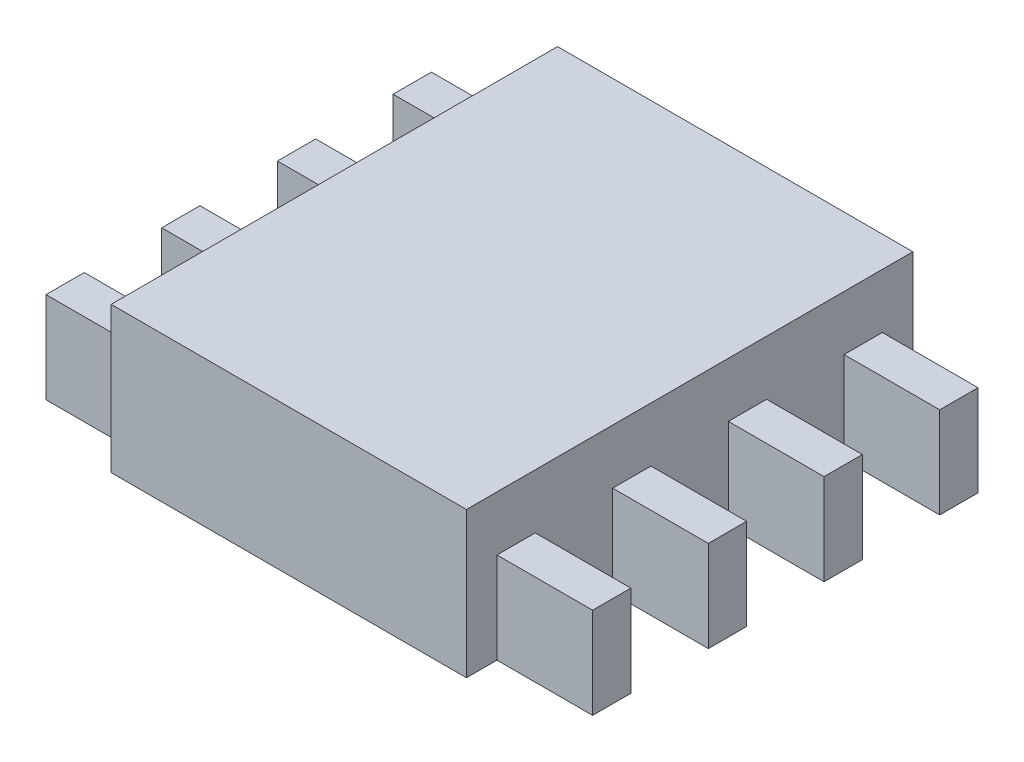
ISO-10303-21;
HEADER;
FILE_DESCRIPTION(('STEP AP214'),'2;1');
FILE_NAME('part.step','',(''),(''),'','','');
FILE_SCHEMA(('AUTOMOTIVE_DESIGN { 1 0 10303 214 1 1 1 1 }'));
ENDSEC;
DATA;
#1=APPLICATION_CONTEXT('core data for automotive mechanical design processes');
#2=APPLICATION_PROTOCOL_DEFINITION('international standard','automotive_design',2000,#1);
#3=PRODUCT_CONTEXT('',#1,'mechanical');
#4=PRODUCT('Part','Part','',(#3));
#5=PRODUCT_RELATED_PRODUCT_CATEGORY('part','',(#4));
#6=PRODUCT_DEFINITION_FORMATION('','',#4);
#7=PRODUCT_DEFINITION_CONTEXT('part definition',#1,'design');
#8=PRODUCT_DEFINITION('design','',#6,#7);
#9=PRODUCT_DEFINITION_SHAPE('','',#8);
#10=(LENGTH_UNIT() NAMED_UNIT(*) SI_UNIT(.MILLI.,.METRE.));
#11=(NAMED_UNIT(*) PLANE_ANGLE_UNIT() SI_UNIT($,.RADIAN.));
#12=(NAMED_UNIT(*) SI_UNIT($,.STERADIAN.) SOLID_ANGLE_UNIT());
#13=UNCERTAINTY_MEASURE_WITH_UNIT(LENGTH_MEASURE(1.E-05),#10,'distance_accuracy_value','');
#14=(GEOMETRIC_REPRESENTATION_CONTEXT(3) GLOBAL_UNCERTAINTY_ASSIGNED_CONTEXT((#13)) GLOBAL_UNIT_ASSIGNED_CONTEXT((#10,
#11,#12)) REPRESENTATION_CONTEXT('',''));
#15=CARTESIAN_POINT('',(0.,0.,0.));
#16=DIRECTION('',(0.,0.,1.));
#17=DIRECTION('',(1.,0.,0.));
#18=AXIS2_PLACEMENT_3D('',#15,#16,#17);
#19=CARTESIAN_POINT('',(1.95,1.6,-2.45));
#20=DIRECTION('',(-1.,0.,0.));
#21=DIRECTION('',(0.,0.,1.));
#22=AXIS2_PLACEMENT_3D('',#19,#20,#21);
#23=PLANE('',#22);
#24=DIRECTION('',(0.,-1.,0.));
#25=VECTOR('',#24,1.);
#26=CARTESIAN_POINT('',(1.95,1.,-1.695));
#27=LINE('',#26,#25);
#28=CARTESIAN_POINT('',(1.95,1.,-1.695));
#29=VERTEX_POINT('',#28);
#30=CARTESIAN_POINT('',(1.95,0.,-1.695));
#31=VERTEX_POINT('',#30);
#32=EDGE_CURVE('E390',#29,#31,#27,.T.);
#33=ORIENTED_EDGE('',*,*,#32,.F.);
#34=DIRECTION('',(0.,0.,1.));
#35=VECTOR('',#34,1.);
#36=CARTESIAN_POINT('',(1.95,1.,-2.115));
#37=LINE('',#36,#35);
#38=CARTESIAN_POINT('',(1.95,1.,-2.115));
#39=VERTEX_POINT('',#38);
#40=EDGE_CURVE('E385',#39,#29,#37,.T.);
#41=ORIENTED_EDGE('',*,*,#40,.F.);
#42=DIRECTION('',(0.,-1.,0.));
#43=VECTOR('',#42,1.);
#44=CARTESIAN_POINT('',(1.95,1.,-2.115));
#45=LINE('',#44,#43);
#46=CARTESIAN_POINT('',(1.95,0.,-2.115));
#47=VERTEX_POINT('',#46);
#48=EDGE_CURVE('E633',#39,#47,#45,.T.);
#49=ORIENTED_EDGE('',*,*,#48,.T.);
#50=DIRECTION('',(0.,0.,-1.));
#51=VECTOR('',#50,1.);
#52=CARTESIAN_POINT('',(1.95,0.,-2.45));
#53=LINE('',#52,#51);
#54=CARTESIAN_POINT('',(1.95,0.,-2.45));
#55=VERTEX_POINT('',#54);
#56=EDGE_CURVE('E371',#47,#55,#53,.T.);
#57=ORIENTED_EDGE('',*,*,#56,.T.);
#58=DIRECTION('',(0.,-1.,0.));
#59=VECTOR('',#58,1.);
#60=CARTESIAN_POINT('',(1.95,1.6,-2.45));
#61=LINE('',#60,#59);
#62=CARTESIAN_POINT('',(1.95,1.6,-2.45));
#63=VERTEX_POINT('',#62);
#64=EDGE_CURVE('E855',#63,#55,#61,.T.);
#65=ORIENTED_EDGE('',*,*,#64,.F.);
#66=DIRECTION('',(0.,0.,-1.));
#67=VECTOR('',#66,1.);
#68=CARTESIAN_POINT('',(1.95,1.6,-2.45));
#69=LINE('',#68,#67);
#70=CARTESIAN_POINT('',(1.95,1.6,2.45));
#71=VERTEX_POINT('',#70);
#72=EDGE_CURVE('E854',#71,#63,#69,.T.);
#73=ORIENTED_EDGE('',*,*,#72,.F.);
#74=DIRECTION('',(0.,-1.,0.));
#75=VECTOR('',#74,1.);
#76=CARTESIAN_POINT('',(1.95,1.6,2.45));
#77=LINE('',#76,#75);
#78=CARTESIAN_POINT('',(1.95,0.,2.45));
#79=VERTEX_POINT('',#78);
#80=EDGE_CURVE('E377',#71,#79,#77,.T.);
#81=ORIENTED_EDGE('',*,*,#80,.T.);
#82=CARTESIAN_POINT('',(1.95,0.,2.115));
#83=VERTEX_POINT('',#82);
#84=EDGE_CURVE('E745',#79,#83,#53,.T.);
#85=ORIENTED_EDGE('',*,*,#84,.T.);
#86=DIRECTION('',(0.,-1.,0.));
#87=VECTOR('',#86,1.);
#88=CARTESIAN_POINT('',(1.95,1.,2.115));
#89=LINE('',#88,#87);
#90=CARTESIAN_POINT('',(1.95,1.,2.115));
#91=VERTEX_POINT('',#90);
#92=EDGE_CURVE('E725',#91,#83,#89,.T.);
#93=ORIENTED_EDGE('',*,*,#92,.F.);
#94=DIRECTION('',(0.,0.,1.));
#95=VECTOR('',#94,1.);
#96=CARTESIAN_POINT('',(1.95,1.,1.695));
#97=LINE('',#96,#95);
#98=CARTESIAN_POINT('',(1.95,1.,1.695));
#99=VERTEX_POINT('',#98);
#100=EDGE_CURVE('E699',#99,#91,#97,.T.);
#101=ORIENTED_EDGE('',*,*,#100,.F.);
#102=DIRECTION('',(0.,-1.,0.));
#103=VECTOR('',#102,1.);
#104=CARTESIAN_POINT('',(1.95,1.,1.695));
#105=LINE('',#104,#103);
#106=CARTESIAN_POINT('',(1.95,0.,1.695));
#107=VERTEX_POINT('',#106);
#108=EDGE_CURVE('E708',#99,#107,#105,.T.);
#109=ORIENTED_EDGE('',*,*,#108,.T.);
#110=CARTESIAN_POINT('',(1.95,0.,0.845));
#111=VERTEX_POINT('',#110);
#112=EDGE_CURVE('E717',#107,#111,#53,.T.);
#113=ORIENTED_EDGE('',*,*,#112,.T.);
#114=DIRECTION('',(0.,-1.,0.));
#115=VECTOR('',#114,1.);
#116=CARTESIAN_POINT('',(1.95,1.,0.845));
#117=LINE('',#116,#115);
#118=CARTESIAN_POINT('',(1.95,1.,0.845));
#119=VERTEX_POINT('',#118);
#120=EDGE_CURVE('E692',#119,#111,#117,.T.);
#121=ORIENTED_EDGE('',*,*,#120,.F.);
#122=DIRECTION('',(0.,0.,1.));
#123=VECTOR('',#122,1.);
#124=CARTESIAN_POINT('',(1.95,1.,0.425));
#125=LINE('',#124,#123);
#126=CARTESIAN_POINT('',(1.95,1.,0.425));
#127=VERTEX_POINT('',#126);
#128=EDGE_CURVE('E673',#127,#119,#125,.T.);
#129=ORIENTED_EDGE('',*,*,#128,.F.);
#130=DIRECTION('',(0.,-1.,0.));
#131=VECTOR('',#130,1.);
#132=CARTESIAN_POINT('',(1.95,1.,0.425));
#133=LINE('',#132,#131);
#134=CARTESIAN_POINT('',(1.95,0.,0.425));
#135=VERTEX_POINT('',#134);
#136=EDGE_CURVE('E683',#127,#135,#133,.T.);
#137=ORIENTED_EDGE('',*,*,#136,.T.);
#138=CARTESIAN_POINT('',(1.95,0.,-0.425));
#139=VERTEX_POINT('',#138);
#140=EDGE_CURVE('E732',#135,#139,#53,.T.);
#141=ORIENTED_EDGE('',*,*,#140,.T.);
#142=DIRECTION('',(0.,-1.,0.));
#143=VECTOR('',#142,1.);
#144=CARTESIAN_POINT('',(1.95,1.,-0.425));
#145=LINE('',#144,#143);
#146=CARTESIAN_POINT('',(1.95,1.,-0.425));
#147=VERTEX_POINT('',#146);
#148=EDGE_CURVE('E663',#147,#139,#145,.T.);
#149=ORIENTED_EDGE('',*,*,#148,.F.);
#150=DIRECTION('',(0.,0.,1.));
#151=VECTOR('',#150,1.);
#152=CARTESIAN_POINT('',(1.95,1.,-0.845));
#153=LINE('',#152,#151);
#154=CARTESIAN_POINT('',(1.95,1.,-0.845));
#155=VERTEX_POINT('',#154);
#156=EDGE_CURVE('E644',#155,#147,#153,.T.);
#157=ORIENTED_EDGE('',*,*,#156,.F.);
#158=DIRECTION('',(0.,-1.,0.));
#159=VECTOR('',#158,1.);
#160=CARTESIAN_POINT('',(1.95,1.,-0.845));
#161=LINE('',#160,#159);
#162=CARTESIAN_POINT('',(1.95,0.,-0.845));
#163=VERTEX_POINT('',#162);
#164=EDGE_CURVE('E654',#155,#163,#161,.T.);
#165=ORIENTED_EDGE('',*,*,#164,.T.);
#166=EDGE_CURVE('E733',#163,#31,#53,.T.);
#167=ORIENTED_EDGE('',*,*,#166,.T.);
#168=EDGE_LOOP('',(#33,#41,#49,#57,#65,#73,#81,#85,#93,#101,#109,#113,#121,#129,#137,#141,#149,
#157,#165,#167));
#169=FACE_BOUND('',#168,.T.);
#170=ADVANCED_FACE('F367',(#169),#23,.F.);
#171=CARTESIAN_POINT('',(-1.95,1.6,-2.45));
#172=DIRECTION('',(1.,0.,0.));
#173=DIRECTION('',(0.,0.,-1.));
#174=AXIS2_PLACEMENT_3D('',#171,#172,#173);
#175=PLANE('',#174);
#176=DIRECTION('',(0.,-1.,0.));
#177=VECTOR('',#176,1.);
#178=CARTESIAN_POINT('',(-1.95,1.,1.695));
#179=LINE('',#178,#177);
#180=CARTESIAN_POINT('',(-1.95,1.,1.695));
#181=VERTEX_POINT('',#180);
#182=CARTESIAN_POINT('',(-1.95,0.,1.695));
#183=VERTEX_POINT('',#182);
#184=EDGE_CURVE('E952',#181,#183,#179,.T.);
#185=ORIENTED_EDGE('',*,*,#184,.F.);
#186=DIRECTION('',(0.,0.,-1.));
#187=VECTOR('',#186,1.);
#188=CARTESIAN_POINT('',(-1.95,1.,1.695));
#189=LINE('',#188,#187);
#190=CARTESIAN_POINT('',(-1.95,1.,2.115));
#191=VERTEX_POINT('',#190);
#192=EDGE_CURVE('E932',#191,#181,#189,.T.);
#193=ORIENTED_EDGE('',*,*,#192,.F.);
#194=DIRECTION('',(0.,-1.,0.));
#195=VECTOR('',#194,1.);
#196=CARTESIAN_POINT('',(-1.95,1.,2.115));
#197=LINE('',#196,#195);
#198=CARTESIAN_POINT('',(-1.95,0.,2.115));
#199=VERTEX_POINT('',#198);
#200=EDGE_CURVE('E923',#191,#199,#197,.T.);
#201=ORIENTED_EDGE('',*,*,#200,.T.);
#202=DIRECTION('',(0.,0.,1.));
#203=VECTOR('',#202,1.);
#204=CARTESIAN_POINT('',(-1.95,0.,-2.45));
#205=LINE('',#204,#203);
#206=CARTESIAN_POINT('',(-1.95,0.,2.45));
#207=VERTEX_POINT('',#206);
#208=EDGE_CURVE('E748',#199,#207,#205,.T.);
#209=ORIENTED_EDGE('',*,*,#208,.T.);
#210=DIRECTION('',(0.,-1.,0.));
#211=VECTOR('',#210,1.);
#212=CARTESIAN_POINT('',(-1.95,1.6,2.45));
#213=LINE('',#212,#211);
#214=CARTESIAN_POINT('',(-1.95,1.6,2.45));
#215=VERTEX_POINT('',#214);
#216=EDGE_CURVE('E11',#215,#207,#213,.T.);
#217=ORIENTED_EDGE('',*,*,#216,.F.);
#218=DIRECTION('',(0.,0.,1.));
#219=VECTOR('',#218,1.);
#220=CARTESIAN_POINT('',(-1.95,1.6,-2.45));
#221=LINE('',#220,#219);
#222=CARTESIAN_POINT('',(-1.95,1.6,-2.45));
#223=VERTEX_POINT('',#222);
#224=EDGE_CURVE('E912',#223,#215,#221,.T.);
#225=ORIENTED_EDGE('',*,*,#224,.F.);
#226=DIRECTION('',(0.,-1.,0.));
#227=VECTOR('',#226,1.);
#228=CARTESIAN_POINT('',(-1.95,1.6,-2.45));
#229=LINE('',#228,#227);
#230=CARTESIAN_POINT('',(-1.95,0.,-2.45));
#231=VERTEX_POINT('',#230);
#232=EDGE_CURVE('E910',#223,#231,#229,.T.);
#233=ORIENTED_EDGE('',*,*,#232,.T.);
#234=CARTESIAN_POINT('',(-1.95,0.,-2.115));
#235=VERTEX_POINT('',#234);
#236=EDGE_CURVE('E765',#231,#235,#205,.T.);
#237=ORIENTED_EDGE('',*,*,#236,.T.);
#238=DIRECTION('',(0.,-1.,0.));
#239=VECTOR('',#238,1.);
#240=CARTESIAN_POINT('',(-1.95,1.,-2.115));
#241=LINE('',#240,#239);
#242=CARTESIAN_POINT('',(-1.95,1.,-2.115));
#243=VERTEX_POINT('',#242);
#244=EDGE_CURVE('E751',#243,#235,#241,.T.);
#245=ORIENTED_EDGE('',*,*,#244,.F.);
#246=DIRECTION('',(0.,0.,-1.));
#247=VECTOR('',#246,1.);
#248=CARTESIAN_POINT('',(-1.95,1.,-2.115));
#249=LINE('',#248,#247);
#250=CARTESIAN_POINT('',(-1.95,1.,-1.695));
#251=VERTEX_POINT('',#250);
#252=EDGE_CURVE('E781',#251,#243,#249,.T.);
#253=ORIENTED_EDGE('',*,*,#252,.F.);
#254=DIRECTION('',(0.,-1.,0.));
#255=VECTOR('',#254,1.);
#256=CARTESIAN_POINT('',(-1.95,1.,-1.695));
#257=LINE('',#256,#255);
#258=CARTESIAN_POINT('',(-1.95,0.,-1.695));
#259=VERTEX_POINT('',#258);
#260=EDGE_CURVE('E782',#251,#259,#257,.T.);
#261=ORIENTED_EDGE('',*,*,#260,.T.);
#262=CARTESIAN_POINT('',(-1.95,0.,-0.844999999999999));
#263=VERTEX_POINT('',#262);
#264=EDGE_CURVE('E760',#259,#263,#205,.T.);
#265=ORIENTED_EDGE('',*,*,#264,.T.);
#266=DIRECTION('',(0.,-1.,0.));
#267=VECTOR('',#266,1.);
#268=CARTESIAN_POINT('',(-1.95,1.,-0.844999999999999));
#269=LINE('',#268,#267);
#270=CARTESIAN_POINT('',(-1.95,1.,-0.845));
#271=VERTEX_POINT('',#270);
#272=EDGE_CURVE('E777',#271,#263,#269,.T.);
#273=ORIENTED_EDGE('',*,*,#272,.F.);
#274=DIRECTION('',(0.,0.,-1.));
#275=VECTOR('',#274,1.);
#276=CARTESIAN_POINT('',(-1.95,1.,-0.844999999999999));
#277=LINE('',#276,#275);
#278=CARTESIAN_POINT('',(-1.95,1.,-0.425));
#279=VERTEX_POINT('',#278);
#280=EDGE_CURVE('E991',#279,#271,#277,.T.);
#281=ORIENTED_EDGE('',*,*,#280,.F.);
#282=DIRECTION('',(0.,-1.,0.));
#283=VECTOR('',#282,1.);
#284=CARTESIAN_POINT('',(-1.95,1.,-0.424999999999999));
#285=LINE('',#284,#283);
#286=CARTESIAN_POINT('',(-1.95,0.,-0.424999999999999));
#287=VERTEX_POINT('',#286);
#288=EDGE_CURVE('E1001',#279,#287,#285,.T.);
#289=ORIENTED_EDGE('',*,*,#288,.T.);
#290=CARTESIAN_POINT('',(-1.95,0.,0.425));
#291=VERTEX_POINT('',#290);
#292=EDGE_CURVE('E766',#287,#291,#205,.T.);
#293=ORIENTED_EDGE('',*,*,#292,.T.);
#294=DIRECTION('',(0.,-1.,0.));
#295=VECTOR('',#294,1.);
#296=CARTESIAN_POINT('',(-1.95,1.,0.425));
#297=LINE('',#296,#295);
#298=CARTESIAN_POINT('',(-1.95,1.,0.425));
#299=VERTEX_POINT('',#298);
#300=EDGE_CURVE('E981',#299,#291,#297,.T.);
#301=ORIENTED_EDGE('',*,*,#300,.F.);
#302=DIRECTION('',(0.,0.,-1.));
#303=VECTOR('',#302,1.);
#304=CARTESIAN_POINT('',(-1.95,1.,0.425));
#305=LINE('',#304,#303);
#306=CARTESIAN_POINT('',(-1.95,1.,0.845));
#307=VERTEX_POINT('',#306);
#308=EDGE_CURVE('E962',#307,#299,#305,.T.);
#309=ORIENTED_EDGE('',*,*,#308,.F.);
#310=DIRECTION('',(0.,-1.,0.));
#311=VECTOR('',#310,1.);
#312=CARTESIAN_POINT('',(-1.95,1.,0.845));
#313=LINE('',#312,#311);
#314=CARTESIAN_POINT('',(-1.95,0.,0.845));
#315=VERTEX_POINT('',#314);
#316=EDGE_CURVE('E972',#307,#315,#313,.T.);
#317=ORIENTED_EDGE('',*,*,#316,.T.);
#318=EDGE_CURVE('E750',#315,#183,#205,.T.);
#319=ORIENTED_EDGE('',*,*,#318,.T.);
#320=EDGE_LOOP('',(#185,#193,#201,#209,#217,#225,#233,#237,#245,#253,#261,#265,#273,#281,#289,
#293,#301,#309,#317,#319));
#321=FACE_BOUND('',#320,.T.);
#322=ADVANCED_FACE('F369',(#321),#175,.F.);
#323=CARTESIAN_POINT('',(-1.95,1.6,2.45));
#324=DIRECTION('',(0.,0.,-1.));
#325=DIRECTION('',(-1.,0.,0.));
#326=AXIS2_PLACEMENT_3D('',#323,#324,#325);
#327=PLANE('',#326);
#328=DIRECTION('',(1.,0.,0.));
#329=VECTOR('',#328,1.);
#330=CARTESIAN_POINT('',(-1.95,0.,2.45));
#331=LINE('',#330,#329);
#332=EDGE_CURVE('E737',#207,#79,#331,.T.);
#333=ORIENTED_EDGE('',*,*,#332,.T.);
#334=ORIENTED_EDGE('',*,*,#80,.F.);
#335=DIRECTION('',(1.,0.,0.));
#336=VECTOR('',#335,1.);
#337=CARTESIAN_POINT('',(-1.95,1.6,2.45));
#338=LINE('',#337,#336);
#339=EDGE_CURVE('E914',#215,#71,#338,.T.);
#340=ORIENTED_EDGE('',*,*,#339,.F.);
#341=ORIENTED_EDGE('',*,*,#216,.T.);
#342=EDGE_LOOP('',(#333,#334,#340,#341));
#343=FACE_BOUND('',#342,.T.);
#344=ADVANCED_FACE('F836',(#343),#327,.F.);
#345=CARTESIAN_POINT('',(-1.95,1.6,-2.45));
#346=DIRECTION('',(0.,0.,1.));
#347=DIRECTION('',(1.,0.,0.));
#348=AXIS2_PLACEMENT_3D('',#345,#346,#347);
#349=PLANE('',#348);
#350=DIRECTION('',(-1.,0.,0.));
#351=VECTOR('',#350,1.);
#352=CARTESIAN_POINT('',(-1.95,0.,-2.45));
#353=LINE('',#352,#351);
#354=EDGE_CURVE('E739',#55,#231,#353,.T.);
#355=ORIENTED_EDGE('',*,*,#354,.T.);
#356=ORIENTED_EDGE('',*,*,#232,.F.);
#357=DIRECTION('',(-1.,0.,0.));
#358=VECTOR('',#357,1.);
#359=CARTESIAN_POINT('',(-1.95,1.6,-2.45));
#360=LINE('',#359,#358);
#361=EDGE_CURVE('E909',#63,#223,#360,.T.);
#362=ORIENTED_EDGE('',*,*,#361,.F.);
#363=ORIENTED_EDGE('',*,*,#64,.T.);
#364=EDGE_LOOP('',(#355,#356,#362,#363));
#365=FACE_BOUND('',#364,.T.);
#366=ADVANCED_FACE('F838',(#365),#349,.F.);
#367=CARTESIAN_POINT('',(-1.95,1.6,2.45));
#368=DIRECTION('',(0.,1.,0.));
#369=DIRECTION('',(0.,0.,1.));
#370=AXIS2_PLACEMENT_3D('',#367,#368,#369);
#371=PLANE('',#370);
#372=ORIENTED_EDGE('',*,*,#224,.T.);
#373=ORIENTED_EDGE('',*,*,#339,.T.);
#374=ORIENTED_EDGE('',*,*,#72,.T.);
#375=ORIENTED_EDGE('',*,*,#361,.T.);
#376=EDGE_LOOP('',(#372,#373,#374,#375));
#377=FACE_BOUND('',#376,.T.);
#378=ADVANCED_FACE('F828',(#377),#371,.T.);
#379=CARTESIAN_POINT('',(-1.95,0.,2.45));
#380=DIRECTION('',(0.,1.,0.));
#381=DIRECTION('',(0.,0.,1.));
#382=AXIS2_PLACEMENT_3D('',#379,#380,#381);
#383=PLANE('',#382);
#384=ORIENTED_EDGE('',*,*,#236,.F.);
#385=ORIENTED_EDGE('',*,*,#354,.F.);
#386=ORIENTED_EDGE('',*,*,#56,.F.);
#387=DIRECTION('',(-1.,0.,0.));
#388=VECTOR('',#387,1.);
#389=CARTESIAN_POINT('',(1.95,0.,-2.115));
#390=LINE('',#389,#388);
#391=CARTESIAN_POINT('',(3.,0.,-2.115));
#392=VERTEX_POINT('',#391);
#393=EDGE_CURVE('E623',#392,#47,#390,.T.);
#394=ORIENTED_EDGE('',*,*,#393,.F.);
#395=DIRECTION('',(0.,0.,-1.));
#396=VECTOR('',#395,1.);
#397=CARTESIAN_POINT('',(3.,0.,-2.115));
#398=LINE('',#397,#396);
#399=CARTESIAN_POINT('',(3.,0.,-1.695));
#400=VERTEX_POINT('',#399);
#401=EDGE_CURVE('E610',#400,#392,#398,.T.);
#402=ORIENTED_EDGE('',*,*,#401,.F.);
#403=DIRECTION('',(1.,0.,0.));
#404=VECTOR('',#403,1.);
#405=CARTESIAN_POINT('',(1.95,0.,-1.695));
#406=LINE('',#405,#404);
#407=EDGE_CURVE('E603',#31,#400,#406,.T.);
#408=ORIENTED_EDGE('',*,*,#407,.F.);
#409=ORIENTED_EDGE('',*,*,#166,.F.);
#410=DIRECTION('',(-1.,0.,0.));
#411=VECTOR('',#410,1.);
#412=CARTESIAN_POINT('',(1.95,0.,-0.845));
#413=LINE('',#412,#411);
#414=CARTESIAN_POINT('',(3.,0.,-0.845));
#415=VERTEX_POINT('',#414);
#416=EDGE_CURVE('E641',#415,#163,#413,.T.);
#417=ORIENTED_EDGE('',*,*,#416,.F.);
#418=DIRECTION('',(0.,0.,-1.));
#419=VECTOR('',#418,1.);
#420=CARTESIAN_POINT('',(3.,0.,-0.845));
#421=LINE('',#420,#419);
#422=CARTESIAN_POINT('',(3.,0.,-0.425));
#423=VERTEX_POINT('',#422);
#424=EDGE_CURVE('E639',#423,#415,#421,.T.);
#425=ORIENTED_EDGE('',*,*,#424,.F.);
#426=DIRECTION('',(1.,0.,0.));
#427=VECTOR('',#426,1.);
#428=CARTESIAN_POINT('',(1.95,0.,-0.425));
#429=LINE('',#428,#427);
#430=EDGE_CURVE('E637',#139,#423,#429,.T.);
#431=ORIENTED_EDGE('',*,*,#430,.F.);
#432=ORIENTED_EDGE('',*,*,#140,.F.);
#433=DIRECTION('',(-1.,0.,0.));
#434=VECTOR('',#433,1.);
#435=CARTESIAN_POINT('',(1.95,0.,0.425));
#436=LINE('',#435,#434);
#437=CARTESIAN_POINT('',(3.,0.,0.425));
#438=VERTEX_POINT('',#437);
#439=EDGE_CURVE('E670',#438,#135,#436,.T.);
#440=ORIENTED_EDGE('',*,*,#439,.F.);
#441=DIRECTION('',(0.,0.,-1.));
#442=VECTOR('',#441,1.);
#443=CARTESIAN_POINT('',(3.,0.,0.425));
#444=LINE('',#443,#442);
#445=CARTESIAN_POINT('',(3.,0.,0.845));
#446=VERTEX_POINT('',#445);
#447=EDGE_CURVE('E668',#446,#438,#444,.T.);
#448=ORIENTED_EDGE('',*,*,#447,.F.);
#449=DIRECTION('',(1.,0.,0.));
#450=VECTOR('',#449,1.);
#451=CARTESIAN_POINT('',(1.95,0.,0.845));
#452=LINE('',#451,#450);
#453=EDGE_CURVE('E666',#111,#446,#452,.T.);
#454=ORIENTED_EDGE('',*,*,#453,.F.);
#455=ORIENTED_EDGE('',*,*,#112,.F.);
#456=DIRECTION('',(-1.,0.,0.));
#457=VECTOR('',#456,1.);
#458=CARTESIAN_POINT('',(1.95,0.,1.695));
#459=LINE('',#458,#457);
#460=CARTESIAN_POINT('',(3.,0.,1.695));
#461=VERTEX_POINT('',#460);
#462=EDGE_CURVE('E698',#461,#107,#459,.T.);
#463=ORIENTED_EDGE('',*,*,#462,.F.);
#464=DIRECTION('',(0.,0.,-1.));
#465=VECTOR('',#464,1.);
#466=CARTESIAN_POINT('',(3.,0.,1.695));
#467=LINE('',#466,#465);
#468=CARTESIAN_POINT('',(3.,0.,2.115));
#469=VERTEX_POINT('',#468);
#470=EDGE_CURVE('E696',#469,#461,#467,.T.);
#471=ORIENTED_EDGE('',*,*,#470,.F.);
#472=DIRECTION('',(1.,0.,0.));
#473=VECTOR('',#472,1.);
#474=CARTESIAN_POINT('',(1.95,0.,2.115));
#475=LINE('',#474,#473);
#476=EDGE_CURVE('E695',#83,#469,#475,.T.);
#477=ORIENTED_EDGE('',*,*,#476,.F.);
#478=ORIENTED_EDGE('',*,*,#84,.F.);
#479=ORIENTED_EDGE('',*,*,#332,.F.);
#480=ORIENTED_EDGE('',*,*,#208,.F.);
#481=DIRECTION('',(1.,0.,0.));
#482=VECTOR('',#481,1.);
#483=CARTESIAN_POINT('',(-1.95,0.,2.115));
#484=LINE('',#483,#482);
#485=CARTESIAN_POINT('',(-3.,0.,2.115));
#486=VERTEX_POINT('',#485);
#487=EDGE_CURVE('E927',#486,#199,#484,.T.);
#488=ORIENTED_EDGE('',*,*,#487,.F.);
#489=DIRECTION('',(0.,0.,1.));
#490=VECTOR('',#489,1.);
#491=CARTESIAN_POINT('',(-3.,0.,1.695));
#492=LINE('',#491,#490);
#493=CARTESIAN_POINT('',(-3.,0.,1.695));
#494=VERTEX_POINT('',#493);
#495=EDGE_CURVE('E929',#494,#486,#492,.T.);
#496=ORIENTED_EDGE('',*,*,#495,.F.);
#497=DIRECTION('',(-1.,0.,0.));
#498=VECTOR('',#497,1.);
#499=CARTESIAN_POINT('',(-1.95,0.,1.695));
#500=LINE('',#499,#498);
#501=EDGE_CURVE('E728',#183,#494,#500,.T.);
#502=ORIENTED_EDGE('',*,*,#501,.F.);
#503=ORIENTED_EDGE('',*,*,#318,.F.);
#504=DIRECTION('',(1.,0.,0.));
#505=VECTOR('',#504,1.);
#506=CARTESIAN_POINT('',(-1.95,0.,0.845));
#507=LINE('',#506,#505);
#508=CARTESIAN_POINT('',(-3.,0.,0.845000000000001));
#509=VERTEX_POINT('',#508);
#510=EDGE_CURVE('E959',#509,#315,#507,.T.);
#511=ORIENTED_EDGE('',*,*,#510,.F.);
#512=DIRECTION('',(0.,0.,1.));
#513=VECTOR('',#512,1.);
#514=CARTESIAN_POINT('',(-3.,0.,0.425));
#515=LINE('',#514,#513);
#516=CARTESIAN_POINT('',(-3.,0.,0.425));
#517=VERTEX_POINT('',#516);
#518=EDGE_CURVE('E957',#517,#509,#515,.T.);
#519=ORIENTED_EDGE('',*,*,#518,.F.);
#520=DIRECTION('',(-1.,0.,0.));
#521=VECTOR('',#520,1.);
#522=CARTESIAN_POINT('',(-1.95,0.,0.425));
#523=LINE('',#522,#521);
#524=EDGE_CURVE('E955',#291,#517,#523,.T.);
#525=ORIENTED_EDGE('',*,*,#524,.F.);
#526=ORIENTED_EDGE('',*,*,#292,.F.);
#527=DIRECTION('',(1.,0.,0.));
#528=VECTOR('',#527,1.);
#529=CARTESIAN_POINT('',(-1.95,0.,-0.424999999999999));
#530=LINE('',#529,#528);
#531=CARTESIAN_POINT('',(-3.,0.,-0.424999999999999));
#532=VERTEX_POINT('',#531);
#533=EDGE_CURVE('E988',#532,#287,#530,.T.);
#534=ORIENTED_EDGE('',*,*,#533,.F.);
#535=DIRECTION('',(0.,0.,1.));
#536=VECTOR('',#535,1.);
#537=CARTESIAN_POINT('',(-3.,0.,-0.844999999999999));
#538=LINE('',#537,#536);
#539=CARTESIAN_POINT('',(-3.,0.,-0.844999999999999));
#540=VERTEX_POINT('',#539);
#541=EDGE_CURVE('E986',#540,#532,#538,.T.);
#542=ORIENTED_EDGE('',*,*,#541,.F.);
#543=DIRECTION('',(-1.,0.,0.));
#544=VECTOR('',#543,1.);
#545=CARTESIAN_POINT('',(-1.95,0.,-0.844999999999999));
#546=LINE('',#545,#544);
#547=EDGE_CURVE('E984',#263,#540,#546,.T.);
#548=ORIENTED_EDGE('',*,*,#547,.F.);
#549=ORIENTED_EDGE('',*,*,#264,.F.);
#550=DIRECTION('',(1.,0.,0.));
#551=VECTOR('',#550,1.);
#552=CARTESIAN_POINT('',(-1.95,0.,-1.695));
#553=LINE('',#552,#551);
#554=CARTESIAN_POINT('',(-3.,0.,-1.695));
#555=VERTEX_POINT('',#554);
#556=EDGE_CURVE('E780',#555,#259,#553,.T.);
#557=ORIENTED_EDGE('',*,*,#556,.F.);
#558=DIRECTION('',(0.,0.,1.));
#559=VECTOR('',#558,1.);
#560=CARTESIAN_POINT('',(-3.,0.,-2.115));
#561=LINE('',#560,#559);
#562=CARTESIAN_POINT('',(-3.,0.,-2.115));
#563=VERTEX_POINT('',#562);
#564=EDGE_CURVE('E776',#563,#555,#561,.T.);
#565=ORIENTED_EDGE('',*,*,#564,.F.);
#566=DIRECTION('',(-1.,0.,0.));
#567=VECTOR('',#566,1.);
#568=CARTESIAN_POINT('',(-1.95,0.,-2.115));
#569=LINE('',#568,#567);
#570=EDGE_CURVE('E774',#235,#563,#569,.T.);
#571=ORIENTED_EDGE('',*,*,#570,.F.);
#572=EDGE_LOOP('',(#384,#385,#386,#394,#402,#408,#409,#417,#425,#431,#432,#440,#448,#454,#455,
#463,#471,#477,#478,#479,#480,#488,#496,#502,#503,#511,#519,#525,#526,#534,#542,#548,#549,#557,
#565,#571));
#573=FACE_BOUND('',#572,.T.);
#574=ADVANCED_FACE('F621',(#573),#383,.F.);
#575=CARTESIAN_POINT('',(-1.95,1.,-2.115));
#576=DIRECTION('',(0.,0.,1.));
#577=DIRECTION('',(1.,0.,0.));
#578=AXIS2_PLACEMENT_3D('',#575,#576,#577);
#579=PLANE('',#578);
#580=ORIENTED_EDGE('',*,*,#570,.T.);
#581=DIRECTION('',(0.,-1.,0.));
#582=VECTOR('',#581,1.);
#583=CARTESIAN_POINT('',(-3.,1.,-2.115));
#584=LINE('',#583,#582);
#585=CARTESIAN_POINT('',(-3.,1.,-2.115));
#586=VERTEX_POINT('',#585);
#587=EDGE_CURVE('E755',#586,#563,#584,.T.);
#588=ORIENTED_EDGE('',*,*,#587,.F.);
#589=DIRECTION('',(-1.,0.,0.));
#590=VECTOR('',#589,1.);
#591=CARTESIAN_POINT('',(-1.95,1.,-2.115));
#592=LINE('',#591,#590);
#593=EDGE_CURVE('E810',#243,#586,#592,.T.);
#594=ORIENTED_EDGE('',*,*,#593,.F.);
#595=ORIENTED_EDGE('',*,*,#244,.T.);
#596=EDGE_LOOP('',(#580,#588,#594,#595));
#597=FACE_BOUND('',#596,.T.);
#598=ADVANCED_FACE('F820',(#597),#579,.F.);
#599=CARTESIAN_POINT('',(-3.,1.,-2.115));
#600=DIRECTION('',(1.,0.,0.));
#601=DIRECTION('',(0.,0.,-1.));
#602=AXIS2_PLACEMENT_3D('',#599,#600,#601);
#603=PLANE('',#602);
#604=ORIENTED_EDGE('',*,*,#564,.T.);
#605=DIRECTION('',(0.,-1.,0.));
#606=VECTOR('',#605,1.);
#607=CARTESIAN_POINT('',(-3.,1.,-1.695));
#608=LINE('',#607,#606);
#609=CARTESIAN_POINT('',(-3.,1.,-1.695));
#610=VERTEX_POINT('',#609);
#611=EDGE_CURVE('E785',#610,#555,#608,.T.);
#612=ORIENTED_EDGE('',*,*,#611,.F.);
#613=DIRECTION('',(0.,0.,1.));
#614=VECTOR('',#613,1.);
#615=CARTESIAN_POINT('',(-3.,1.,-2.115));
#616=LINE('',#615,#614);
#617=EDGE_CURVE('E801',#586,#610,#616,.T.);
#618=ORIENTED_EDGE('',*,*,#617,.F.);
#619=ORIENTED_EDGE('',*,*,#587,.T.);
#620=EDGE_LOOP('',(#604,#612,#618,#619));
#621=FACE_BOUND('',#620,.T.);
#622=ADVANCED_FACE('F800',(#621),#603,.F.);
#623=CARTESIAN_POINT('',(-1.95,1.,-1.695));
#624=DIRECTION('',(0.,0.,-1.));
#625=DIRECTION('',(-1.,0.,0.));
#626=AXIS2_PLACEMENT_3D('',#623,#624,#625);
#627=PLANE('',#626);
#628=ORIENTED_EDGE('',*,*,#556,.T.);
#629=ORIENTED_EDGE('',*,*,#260,.F.);
#630=DIRECTION('',(1.,0.,0.));
#631=VECTOR('',#630,1.);
#632=CARTESIAN_POINT('',(-1.95,1.,-1.695));
#633=LINE('',#632,#631);
#634=EDGE_CURVE('E786',#610,#251,#633,.T.);
#635=ORIENTED_EDGE('',*,*,#634,.F.);
#636=ORIENTED_EDGE('',*,*,#611,.T.);
#637=EDGE_LOOP('',(#628,#629,#635,#636));
#638=FACE_BOUND('',#637,.T.);
#639=ADVANCED_FACE('F816',(#638),#627,.F.);
#640=CARTESIAN_POINT('',(-1.95,1.,-2.115));
#641=DIRECTION('',(0.,-1.,0.));
#642=DIRECTION('',(0.,0.,-1.));
#643=AXIS2_PLACEMENT_3D('',#640,#641,#642);
#644=PLANE('',#643);
#645=ORIENTED_EDGE('',*,*,#252,.T.);
#646=ORIENTED_EDGE('',*,*,#593,.T.);
#647=ORIENTED_EDGE('',*,*,#617,.T.);
#648=ORIENTED_EDGE('',*,*,#634,.T.);
#649=EDGE_LOOP('',(#645,#646,#647,#648));
#650=FACE_BOUND('',#649,.T.);
#651=ADVANCED_FACE('F813',(#650),#644,.F.);
#652=CARTESIAN_POINT('',(-1.95,1.,-0.844999999999999));
#653=DIRECTION('',(0.,0.,1.));
#654=DIRECTION('',(1.,0.,0.));
#655=AXIS2_PLACEMENT_3D('',#652,#653,#654);
#656=PLANE('',#655);
#657=ORIENTED_EDGE('',*,*,#547,.T.);
#658=DIRECTION('',(0.,-1.,0.));
#659=VECTOR('',#658,1.);
#660=CARTESIAN_POINT('',(-3.,1.,-0.844999999999999));
#661=LINE('',#660,#659);
#662=CARTESIAN_POINT('',(-3.,1.,-0.844999999999999));
#663=VERTEX_POINT('',#662);
#664=EDGE_CURVE('E1006',#663,#540,#661,.T.);
#665=ORIENTED_EDGE('',*,*,#664,.F.);
#666=DIRECTION('',(-1.,0.,0.));
#667=VECTOR('',#666,1.);
#668=CARTESIAN_POINT('',(-1.95,1.,-0.844999999999999));
#669=LINE('',#668,#667);
#670=EDGE_CURVE('E994',#271,#663,#669,.T.);
#671=ORIENTED_EDGE('',*,*,#670,.F.);
#672=ORIENTED_EDGE('',*,*,#272,.T.);
#673=EDGE_LOOP('',(#657,#665,#671,#672));
#674=FACE_BOUND('',#673,.T.);
#675=ADVANCED_FACE('F1015',(#674),#656,.F.);
#676=CARTESIAN_POINT('',(-3.,1.,-0.844999999999999));
#677=DIRECTION('',(1.,0.,0.));
#678=DIRECTION('',(0.,0.,-1.));
#679=AXIS2_PLACEMENT_3D('',#676,#677,#678);
#680=PLANE('',#679);
#681=ORIENTED_EDGE('',*,*,#541,.T.);
#682=DIRECTION('',(0.,-1.,0.));
#683=VECTOR('',#682,1.);
#684=CARTESIAN_POINT('',(-3.,1.,-0.424999999999999));
#685=LINE('',#684,#683);
#686=CARTESIAN_POINT('',(-3.,1.,-0.424999999999999));
#687=VERTEX_POINT('',#686);
#688=EDGE_CURVE('E1004',#687,#532,#685,.T.);
#689=ORIENTED_EDGE('',*,*,#688,.F.);
#690=DIRECTION('',(0.,0.,1.));
#691=VECTOR('',#690,1.);
#692=CARTESIAN_POINT('',(-3.,1.,-0.844999999999999));
#693=LINE('',#692,#691);
#694=EDGE_CURVE('E996',#663,#687,#693,.T.);
#695=ORIENTED_EDGE('',*,*,#694,.F.);
#696=ORIENTED_EDGE('',*,*,#664,.T.);
#697=EDGE_LOOP('',(#681,#689,#695,#696));
#698=FACE_BOUND('',#697,.T.);
#699=ADVANCED_FACE('F1019',(#698),#680,.F.);
#700=CARTESIAN_POINT('',(-1.95,1.,-0.424999999999999));
#701=DIRECTION('',(0.,0.,-1.));
#702=DIRECTION('',(-1.,0.,0.));
#703=AXIS2_PLACEMENT_3D('',#700,#701,#702);
#704=PLANE('',#703);
#705=ORIENTED_EDGE('',*,*,#533,.T.);
#706=ORIENTED_EDGE('',*,*,#288,.F.);
#707=DIRECTION('',(1.,0.,0.));
#708=VECTOR('',#707,1.);
#709=CARTESIAN_POINT('',(-1.95,1.,-0.424999999999999));
#710=LINE('',#709,#708);
#711=EDGE_CURVE('E998',#687,#279,#710,.T.);
#712=ORIENTED_EDGE('',*,*,#711,.F.);
#713=ORIENTED_EDGE('',*,*,#688,.T.);
#714=EDGE_LOOP('',(#705,#706,#712,#713));
#715=FACE_BOUND('',#714,.T.);
#716=ADVANCED_FACE('F1022',(#715),#704,.F.);
#717=CARTESIAN_POINT('',(-1.95,1.,-0.844999999999999));
#718=DIRECTION('',(0.,-1.,0.));
#719=DIRECTION('',(0.,0.,-1.));
#720=AXIS2_PLACEMENT_3D('',#717,#718,#719);
#721=PLANE('',#720);
#722=ORIENTED_EDGE('',*,*,#280,.T.);
#723=ORIENTED_EDGE('',*,*,#670,.T.);
#724=ORIENTED_EDGE('',*,*,#694,.T.);
#725=ORIENTED_EDGE('',*,*,#711,.T.);
#726=EDGE_LOOP('',(#722,#723,#724,#725));
#727=FACE_BOUND('',#726,.T.);
#728=ADVANCED_FACE('F1025',(#727),#721,.F.);
#729=CARTESIAN_POINT('',(-1.95,1.,0.425));
#730=DIRECTION('',(0.,0.,1.));
#731=DIRECTION('',(1.,0.,0.));
#732=AXIS2_PLACEMENT_3D('',#729,#730,#731);
#733=PLANE('',#732);
#734=ORIENTED_EDGE('',*,*,#524,.T.);
#735=DIRECTION('',(0.,-1.,0.));
#736=VECTOR('',#735,1.);
#737=CARTESIAN_POINT('',(-3.,1.,0.425));
#738=LINE('',#737,#736);
#739=CARTESIAN_POINT('',(-3.,1.,0.425));
#740=VERTEX_POINT('',#739);
#741=EDGE_CURVE('E978',#740,#517,#738,.T.);
#742=ORIENTED_EDGE('',*,*,#741,.F.);
#743=DIRECTION('',(-1.,0.,0.));
#744=VECTOR('',#743,1.);
#745=CARTESIAN_POINT('',(-1.95,1.,0.425));
#746=LINE('',#745,#744);
#747=EDGE_CURVE('E965',#299,#740,#746,.T.);
#748=ORIENTED_EDGE('',*,*,#747,.F.);
#749=ORIENTED_EDGE('',*,*,#300,.T.);
#750=EDGE_LOOP('',(#734,#742,#748,#749));
#751=FACE_BOUND('',#750,.T.);
#752=ADVANCED_FACE('F1027',(#751),#733,.F.);
#753=CARTESIAN_POINT('',(-3.,1.,0.425));
#754=DIRECTION('',(1.,0.,0.));
#755=DIRECTION('',(0.,0.,-1.));
#756=AXIS2_PLACEMENT_3D('',#753,#754,#755);
#757=PLANE('',#756);
#758=ORIENTED_EDGE('',*,*,#518,.T.);
#759=DIRECTION('',(0.,-1.,0.));
#760=VECTOR('',#759,1.);
#761=CARTESIAN_POINT('',(-3.,1.,0.845000000000001));
#762=LINE('',#761,#760);
#763=CARTESIAN_POINT('',(-3.,1.,0.845000000000001));
#764=VERTEX_POINT('',#763);
#765=EDGE_CURVE('E975',#764,#509,#762,.T.);
#766=ORIENTED_EDGE('',*,*,#765,.F.);
#767=DIRECTION('',(0.,0.,1.));
#768=VECTOR('',#767,1.);
#769=CARTESIAN_POINT('',(-3.,1.,0.425));
#770=LINE('',#769,#768);
#771=EDGE_CURVE('E967',#740,#764,#770,.T.);
#772=ORIENTED_EDGE('',*,*,#771,.F.);
#773=ORIENTED_EDGE('',*,*,#741,.T.);
#774=EDGE_LOOP('',(#758,#766,#772,#773));
#775=FACE_BOUND('',#774,.T.);
#776=ADVANCED_FACE('F1033',(#775),#757,.F.);
#777=CARTESIAN_POINT('',(-1.95,1.,0.845));
#778=DIRECTION('',(0.,0.,-1.));
#779=DIRECTION('',(-1.,0.,0.));
#780=AXIS2_PLACEMENT_3D('',#777,#778,#779);
#781=PLANE('',#780);
#782=ORIENTED_EDGE('',*,*,#510,.T.);
#783=ORIENTED_EDGE('',*,*,#316,.F.);
#784=DIRECTION('',(1.,0.,0.));
#785=VECTOR('',#784,1.);
#786=CARTESIAN_POINT('',(-1.95,1.,0.845));
#787=LINE('',#786,#785);
#788=EDGE_CURVE('E969',#764,#307,#787,.T.);
#789=ORIENTED_EDGE('',*,*,#788,.F.);
#790=ORIENTED_EDGE('',*,*,#765,.T.);
#791=EDGE_LOOP('',(#782,#783,#789,#790));
#792=FACE_BOUND('',#791,.T.);
#793=ADVANCED_FACE('F1079',(#792),#781,.F.);
#794=CARTESIAN_POINT('',(-1.95,1.,0.425));
#795=DIRECTION('',(0.,-1.,0.));
#796=DIRECTION('',(0.,0.,-1.));
#797=AXIS2_PLACEMENT_3D('',#794,#795,#796);
#798=PLANE('',#797);
#799=ORIENTED_EDGE('',*,*,#308,.T.);
#800=ORIENTED_EDGE('',*,*,#747,.T.);
#801=ORIENTED_EDGE('',*,*,#771,.T.);
#802=ORIENTED_EDGE('',*,*,#788,.T.);
#803=EDGE_LOOP('',(#799,#800,#801,#802));
#804=FACE_BOUND('',#803,.T.);
#805=ADVANCED_FACE('F1086',(#804),#798,.F.);
#806=CARTESIAN_POINT('',(-1.95,1.,1.695));
#807=DIRECTION('',(0.,0.,1.));
#808=DIRECTION('',(1.,0.,0.));
#809=AXIS2_PLACEMENT_3D('',#806,#807,#808);
#810=PLANE('',#809);
#811=ORIENTED_EDGE('',*,*,#501,.T.);
#812=DIRECTION('',(0.,-1.,0.));
#813=VECTOR('',#812,1.);
#814=CARTESIAN_POINT('',(-3.,1.,1.695));
#815=LINE('',#814,#813);
#816=CARTESIAN_POINT('',(-3.,1.,1.695));
#817=VERTEX_POINT('',#816);
#818=EDGE_CURVE('E949',#817,#494,#815,.T.);
#819=ORIENTED_EDGE('',*,*,#818,.F.);
#820=DIRECTION('',(-1.,0.,0.));
#821=VECTOR('',#820,1.);
#822=CARTESIAN_POINT('',(-1.95,1.,1.695));
#823=LINE('',#822,#821);
#824=EDGE_CURVE('E935',#181,#817,#823,.T.);
#825=ORIENTED_EDGE('',*,*,#824,.F.);
#826=ORIENTED_EDGE('',*,*,#184,.T.);
#827=EDGE_LOOP('',(#811,#819,#825,#826));
#828=FACE_BOUND('',#827,.T.);
#829=ADVANCED_FACE('F1094',(#828),#810,.F.);
#830=CARTESIAN_POINT('',(-3.,1.,1.695));
#831=DIRECTION('',(1.,0.,0.));
#832=DIRECTION('',(0.,0.,-1.));
#833=AXIS2_PLACEMENT_3D('',#830,#831,#832);
#834=PLANE('',#833);
#835=ORIENTED_EDGE('',*,*,#495,.T.);
#836=DIRECTION('',(0.,-1.,0.));
#837=VECTOR('',#836,1.);
#838=CARTESIAN_POINT('',(-3.,1.,2.115));
#839=LINE('',#838,#837);
#840=CARTESIAN_POINT('',(-3.,1.,2.115));
#841=VERTEX_POINT('',#840);
#842=EDGE_CURVE('E947',#841,#486,#839,.T.);
#843=ORIENTED_EDGE('',*,*,#842,.F.);
#844=DIRECTION('',(0.,0.,1.));
#845=VECTOR('',#844,1.);
#846=CARTESIAN_POINT('',(-3.,1.,1.695));
#847=LINE('',#846,#845);
#848=EDGE_CURVE('E941',#817,#841,#847,.T.);
#849=ORIENTED_EDGE('',*,*,#848,.F.);
#850=ORIENTED_EDGE('',*,*,#818,.T.);
#851=EDGE_LOOP('',(#835,#843,#849,#850));
#852=FACE_BOUND('',#851,.T.);
#853=ADVANCED_FACE('F1102',(#852),#834,.F.);
#854=CARTESIAN_POINT('',(-1.95,1.,2.115));
#855=DIRECTION('',(0.,0.,-1.));
#856=DIRECTION('',(-1.,0.,0.));
#857=AXIS2_PLACEMENT_3D('',#854,#855,#856);
#858=PLANE('',#857);
#859=ORIENTED_EDGE('',*,*,#487,.T.);
#860=ORIENTED_EDGE('',*,*,#200,.F.);
#861=DIRECTION('',(1.,0.,0.));
#862=VECTOR('',#861,1.);
#863=CARTESIAN_POINT('',(-1.95,1.,2.115));
#864=LINE('',#863,#862);
#865=EDGE_CURVE('E943',#841,#191,#864,.T.);
#866=ORIENTED_EDGE('',*,*,#865,.F.);
#867=ORIENTED_EDGE('',*,*,#842,.T.);
#868=EDGE_LOOP('',(#859,#860,#866,#867));
#869=FACE_BOUND('',#868,.T.);
#870=ADVANCED_FACE('F1110',(#869),#858,.F.);
#871=CARTESIAN_POINT('',(-1.95,1.,1.695));
#872=DIRECTION('',(0.,-1.,0.));
#873=DIRECTION('',(0.,0.,-1.));
#874=AXIS2_PLACEMENT_3D('',#871,#872,#873);
#875=PLANE('',#874);
#876=ORIENTED_EDGE('',*,*,#192,.T.);
#877=ORIENTED_EDGE('',*,*,#824,.T.);
#878=ORIENTED_EDGE('',*,*,#848,.T.);
#879=ORIENTED_EDGE('',*,*,#865,.T.);
#880=EDGE_LOOP('',(#876,#877,#878,#879));
#881=FACE_BOUND('',#880,.T.);
#882=ADVANCED_FACE('F1118',(#881),#875,.F.);
#883=CARTESIAN_POINT('',(1.95,1.,2.115));
#884=DIRECTION('',(0.,0.,-1.));
#885=DIRECTION('',(-1.,0.,0.));
#886=AXIS2_PLACEMENT_3D('',#883,#884,#885);
#887=PLANE('',#886);
#888=ORIENTED_EDGE('',*,*,#476,.T.);
#889=DIRECTION('',(0.,-1.,0.));
#890=VECTOR('',#889,1.);
#891=CARTESIAN_POINT('',(3.,1.,2.115));
#892=LINE('',#891,#890);
#893=CARTESIAN_POINT('',(3.,1.,2.115));
#894=VERTEX_POINT('',#893);
#895=EDGE_CURVE('E729',#894,#469,#892,.T.);
#896=ORIENTED_EDGE('',*,*,#895,.F.);
#897=DIRECTION('',(1.,0.,0.));
#898=VECTOR('',#897,1.);
#899=CARTESIAN_POINT('',(1.95,1.,2.115));
#900=LINE('',#899,#898);
#901=EDGE_CURVE('E702',#91,#894,#900,.T.);
#902=ORIENTED_EDGE('',*,*,#901,.F.);
#903=ORIENTED_EDGE('',*,*,#92,.T.);
#904=EDGE_LOOP('',(#888,#896,#902,#903));
#905=FACE_BOUND('',#904,.T.);
#906=ADVANCED_FACE('F862',(#905),#887,.F.);
#907=CARTESIAN_POINT('',(3.,1.,1.695));
#908=DIRECTION('',(-1.,0.,0.));
#909=DIRECTION('',(0.,0.,1.));
#910=AXIS2_PLACEMENT_3D('',#907,#908,#909);
#911=PLANE('',#910);
#912=ORIENTED_EDGE('',*,*,#470,.T.);
#913=DIRECTION('',(0.,-1.,0.));
#914=VECTOR('',#913,1.);
#915=CARTESIAN_POINT('',(3.,1.,1.695));
#916=LINE('',#915,#914);
#917=CARTESIAN_POINT('',(3.,1.,1.695));
#918=VERTEX_POINT('',#917);
#919=EDGE_CURVE('E711',#918,#461,#916,.T.);
#920=ORIENTED_EDGE('',*,*,#919,.F.);
#921=DIRECTION('',(0.,0.,-1.));
#922=VECTOR('',#921,1.);
#923=CARTESIAN_POINT('',(3.,1.,1.695));
#924=LINE('',#923,#922);
#925=EDGE_CURVE('E704',#894,#918,#924,.T.);
#926=ORIENTED_EDGE('',*,*,#925,.F.);
#927=ORIENTED_EDGE('',*,*,#895,.T.);
#928=EDGE_LOOP('',(#912,#920,#926,#927));
#929=FACE_BOUND('',#928,.T.);
#930=ADVANCED_FACE('F1132',(#929),#911,.F.);
#931=CARTESIAN_POINT('',(1.95,1.,1.695));
#932=DIRECTION('',(0.,0.,1.));
#933=DIRECTION('',(1.,0.,0.));
#934=AXIS2_PLACEMENT_3D('',#931,#932,#933);
#935=PLANE('',#934);
#936=ORIENTED_EDGE('',*,*,#462,.T.);
#937=ORIENTED_EDGE('',*,*,#108,.F.);
#938=DIRECTION('',(-1.,0.,0.));
#939=VECTOR('',#938,1.);
#940=CARTESIAN_POINT('',(1.95,1.,1.695));
#941=LINE('',#940,#939);
#942=EDGE_CURVE('E706',#918,#99,#941,.T.);
#943=ORIENTED_EDGE('',*,*,#942,.F.);
#944=ORIENTED_EDGE('',*,*,#919,.T.);
#945=EDGE_LOOP('',(#936,#937,#943,#944));
#946=FACE_BOUND('',#945,.T.);
#947=ADVANCED_FACE('F873',(#946),#935,.F.);
#948=CARTESIAN_POINT('',(1.95,1.,2.115));
#949=DIRECTION('',(0.,1.,0.));
#950=DIRECTION('',(0.,0.,1.));
#951=AXIS2_PLACEMENT_3D('',#948,#949,#950);
#952=PLANE('',#951);
#953=ORIENTED_EDGE('',*,*,#100,.T.);
#954=ORIENTED_EDGE('',*,*,#901,.T.);
#955=ORIENTED_EDGE('',*,*,#925,.T.);
#956=ORIENTED_EDGE('',*,*,#942,.T.);
#957=EDGE_LOOP('',(#953,#954,#955,#956));
#958=FACE_BOUND('',#957,.T.);
#959=ADVANCED_FACE('F867',(#958),#952,.T.);
#960=CARTESIAN_POINT('',(1.95,1.,0.845));
#961=DIRECTION('',(0.,0.,-1.));
#962=DIRECTION('',(-1.,0.,0.));
#963=AXIS2_PLACEMENT_3D('',#960,#961,#962);
#964=PLANE('',#963);
#965=ORIENTED_EDGE('',*,*,#453,.T.);
#966=DIRECTION('',(0.,-1.,0.));
#967=VECTOR('',#966,1.);
#968=CARTESIAN_POINT('',(3.,1.,0.845));
#969=LINE('',#968,#967);
#970=CARTESIAN_POINT('',(3.,1.,0.845));
#971=VERTEX_POINT('',#970);
#972=EDGE_CURVE('E689',#971,#446,#969,.T.);
#973=ORIENTED_EDGE('',*,*,#972,.F.);
#974=DIRECTION('',(1.,0.,0.));
#975=VECTOR('',#974,1.);
#976=CARTESIAN_POINT('',(1.95,1.,0.845));
#977=LINE('',#976,#975);
#978=EDGE_CURVE('E676',#119,#971,#977,.T.);
#979=ORIENTED_EDGE('',*,*,#978,.F.);
#980=ORIENTED_EDGE('',*,*,#120,.T.);
#981=EDGE_LOOP('',(#965,#973,#979,#980));
#982=FACE_BOUND('',#981,.T.);
#983=ADVANCED_FACE('F879',(#982),#964,.F.);
#984=CARTESIAN_POINT('',(3.,1.,0.425));
#985=DIRECTION('',(-1.,0.,0.));
#986=DIRECTION('',(0.,0.,1.));
#987=AXIS2_PLACEMENT_3D('',#984,#985,#986);
#988=PLANE('',#987);
#989=ORIENTED_EDGE('',*,*,#447,.T.);
#990=DIRECTION('',(0.,-1.,0.));
#991=VECTOR('',#990,1.);
#992=CARTESIAN_POINT('',(3.,1.,0.425));
#993=LINE('',#992,#991);
#994=CARTESIAN_POINT('',(3.,1.,0.425));
#995=VERTEX_POINT('',#994);
#996=EDGE_CURVE('E686',#995,#438,#993,.T.);
#997=ORIENTED_EDGE('',*,*,#996,.F.);
#998=DIRECTION('',(0.,0.,-1.));
#999=VECTOR('',#998,1.);
#1000=CARTESIAN_POINT('',(3.,1.,0.425));
#1001=LINE('',#1000,#999);
#1002=EDGE_CURVE('E678',#971,#995,#1001,.T.);
#1003=ORIENTED_EDGE('',*,*,#1002,.F.);
#1004=ORIENTED_EDGE('',*,*,#972,.T.);
#1005=EDGE_LOOP('',(#989,#997,#1003,#1004));
#1006=FACE_BOUND('',#1005,.T.);
#1007=ADVANCED_FACE('F1158',(#1006),#988,.F.);
#1008=CARTESIAN_POINT('',(1.95,1.,0.425));
#1009=DIRECTION('',(0.,0.,1.));
#1010=DIRECTION('',(1.,0.,0.));
#1011=AXIS2_PLACEMENT_3D('',#1008,#1009,#1010);
#1012=PLANE('',#1011);
#1013=ORIENTED_EDGE('',*,*,#439,.T.);
#1014=ORIENTED_EDGE('',*,*,#136,.F.);
#1015=DIRECTION('',(-1.,0.,0.));
#1016=VECTOR('',#1015,1.);
#1017=CARTESIAN_POINT('',(1.95,1.,0.425));
#1018=LINE('',#1017,#1016);
#1019=EDGE_CURVE('E680',#995,#127,#1018,.T.);
#1020=ORIENTED_EDGE('',*,*,#1019,.F.);
#1021=ORIENTED_EDGE('',*,*,#996,.T.);
#1022=EDGE_LOOP('',(#1013,#1014,#1020,#1021));
#1023=FACE_BOUND('',#1022,.T.);
#1024=ADVANCED_FACE('F887',(#1023),#1012,.F.);
#1025=CARTESIAN_POINT('',(1.95,1.,0.845));
#1026=DIRECTION('',(0.,1.,0.));
#1027=DIRECTION('',(0.,0.,1.));
#1028=AXIS2_PLACEMENT_3D('',#1025,#1026,#1027);
#1029=PLANE('',#1028);
#1030=ORIENTED_EDGE('',*,*,#128,.T.);
#1031=ORIENTED_EDGE('',*,*,#978,.T.);
#1032=ORIENTED_EDGE('',*,*,#1002,.T.);
#1033=ORIENTED_EDGE('',*,*,#1019,.T.);
#1034=EDGE_LOOP('',(#1030,#1031,#1032,#1033));
#1035=FACE_BOUND('',#1034,.T.);
#1036=ADVANCED_FACE('F882',(#1035),#1029,.T.);
#1037=CARTESIAN_POINT('',(1.95,1.,-0.425));
#1038=DIRECTION('',(0.,0.,-1.));
#1039=DIRECTION('',(-1.,0.,0.));
#1040=AXIS2_PLACEMENT_3D('',#1037,#1038,#1039);
#1041=PLANE('',#1040);
#1042=ORIENTED_EDGE('',*,*,#430,.T.);
#1043=DIRECTION('',(0.,-1.,0.));
#1044=VECTOR('',#1043,1.);
#1045=CARTESIAN_POINT('',(3.,1.,-0.425));
#1046=LINE('',#1045,#1044);
#1047=CARTESIAN_POINT('',(3.,1.,-0.425));
#1048=VERTEX_POINT('',#1047);
#1049=EDGE_CURVE('E660',#1048,#423,#1046,.T.);
#1050=ORIENTED_EDGE('',*,*,#1049,.F.);
#1051=DIRECTION('',(1.,0.,0.));
#1052=VECTOR('',#1051,1.);
#1053=CARTESIAN_POINT('',(1.95,1.,-0.425));
#1054=LINE('',#1053,#1052);
#1055=EDGE_CURVE('E647',#147,#1048,#1054,.T.);
#1056=ORIENTED_EDGE('',*,*,#1055,.F.);
#1057=ORIENTED_EDGE('',*,*,#148,.T.);
#1058=EDGE_LOOP('',(#1042,#1050,#1056,#1057));
#1059=FACE_BOUND('',#1058,.T.);
#1060=ADVANCED_FACE('F895',(#1059),#1041,.F.);
#1061=CARTESIAN_POINT('',(3.,1.,-0.845));
#1062=DIRECTION('',(-1.,0.,0.));
#1063=DIRECTION('',(0.,0.,1.));
#1064=AXIS2_PLACEMENT_3D('',#1061,#1062,#1063);
#1065=PLANE('',#1064);
#1066=ORIENTED_EDGE('',*,*,#424,.T.);
#1067=DIRECTION('',(0.,-1.,0.));
#1068=VECTOR('',#1067,1.);
#1069=CARTESIAN_POINT('',(3.,1.,-0.845));
#1070=LINE('',#1069,#1068);
#1071=CARTESIAN_POINT('',(3.,1.,-0.845));
#1072=VERTEX_POINT('',#1071);
#1073=EDGE_CURVE('E657',#1072,#415,#1070,.T.);
#1074=ORIENTED_EDGE('',*,*,#1073,.F.);
#1075=DIRECTION('',(0.,0.,-1.));
#1076=VECTOR('',#1075,1.);
#1077=CARTESIAN_POINT('',(3.,1.,-0.845));
#1078=LINE('',#1077,#1076);
#1079=EDGE_CURVE('E649',#1048,#1072,#1078,.T.);
#1080=ORIENTED_EDGE('',*,*,#1079,.F.);
#1081=ORIENTED_EDGE('',*,*,#1049,.T.);
#1082=EDGE_LOOP('',(#1066,#1074,#1080,#1081));
#1083=FACE_BOUND('',#1082,.T.);
#1084=ADVANCED_FACE('F1184',(#1083),#1065,.F.);
#1085=CARTESIAN_POINT('',(1.95,1.,-0.845));
#1086=DIRECTION('',(0.,0.,1.));
#1087=DIRECTION('',(1.,0.,0.));
#1088=AXIS2_PLACEMENT_3D('',#1085,#1086,#1087);
#1089=PLANE('',#1088);
#1090=ORIENTED_EDGE('',*,*,#416,.T.);
#1091=ORIENTED_EDGE('',*,*,#164,.F.);
#1092=DIRECTION('',(-1.,0.,0.));
#1093=VECTOR('',#1092,1.);
#1094=CARTESIAN_POINT('',(1.95,1.,-0.845));
#1095=LINE('',#1094,#1093);
#1096=EDGE_CURVE('E651',#1072,#155,#1095,.T.);
#1097=ORIENTED_EDGE('',*,*,#1096,.F.);
#1098=ORIENTED_EDGE('',*,*,#1073,.T.);
#1099=EDGE_LOOP('',(#1090,#1091,#1097,#1098));
#1100=FACE_BOUND('',#1099,.T.);
#1101=ADVANCED_FACE('F902',(#1100),#1089,.F.);
#1102=CARTESIAN_POINT('',(1.95,1.,-0.425));
#1103=DIRECTION('',(0.,1.,0.));
#1104=DIRECTION('',(0.,0.,1.));
#1105=AXIS2_PLACEMENT_3D('',#1102,#1103,#1104);
#1106=PLANE('',#1105);
#1107=ORIENTED_EDGE('',*,*,#156,.T.);
#1108=ORIENTED_EDGE('',*,*,#1055,.T.);
#1109=ORIENTED_EDGE('',*,*,#1079,.T.);
#1110=ORIENTED_EDGE('',*,*,#1096,.T.);
#1111=EDGE_LOOP('',(#1107,#1108,#1109,#1110));
#1112=FACE_BOUND('',#1111,.T.);
#1113=ADVANCED_FACE('F898',(#1112),#1106,.T.);
#1114=CARTESIAN_POINT('',(1.95,1.,-1.695));
#1115=DIRECTION('',(0.,0.,-1.));
#1116=DIRECTION('',(-1.,0.,0.));
#1117=AXIS2_PLACEMENT_3D('',#1114,#1115,#1116);
#1118=PLANE('',#1117);
#1119=ORIENTED_EDGE('',*,*,#407,.T.);
#1120=DIRECTION('',(0.,-1.,0.));
#1121=VECTOR('',#1120,1.);
#1122=CARTESIAN_POINT('',(3.,1.,-1.695));
#1123=LINE('',#1122,#1121);
#1124=CARTESIAN_POINT('',(3.,1.,-1.695));
#1125=VERTEX_POINT('',#1124);
#1126=EDGE_CURVE('E606',#1125,#400,#1123,.T.);
#1127=ORIENTED_EDGE('',*,*,#1126,.F.);
#1128=DIRECTION('',(1.,0.,0.));
#1129=VECTOR('',#1128,1.);
#1130=CARTESIAN_POINT('',(1.95,1.,-1.695));
#1131=LINE('',#1130,#1129);
#1132=EDGE_CURVE('E628',#29,#1125,#1131,.T.);
#1133=ORIENTED_EDGE('',*,*,#1132,.F.);
#1134=ORIENTED_EDGE('',*,*,#32,.T.);
#1135=EDGE_LOOP('',(#1119,#1127,#1133,#1134));
#1136=FACE_BOUND('',#1135,.T.);
#1137=ADVANCED_FACE('F605',(#1136),#1118,.F.);
#1138=CARTESIAN_POINT('',(3.,1.,-2.115));
#1139=DIRECTION('',(-1.,0.,0.));
#1140=DIRECTION('',(0.,0.,1.));
#1141=AXIS2_PLACEMENT_3D('',#1138,#1139,#1140);
#1142=PLANE('',#1141);
#1143=ORIENTED_EDGE('',*,*,#401,.T.);
#1144=DIRECTION('',(0.,-1.,0.));
#1145=VECTOR('',#1144,1.);
#1146=CARTESIAN_POINT('',(3.,1.,-2.115));
#1147=LINE('',#1146,#1145);
#1148=CARTESIAN_POINT('',(3.,1.,-2.115));
#1149=VERTEX_POINT('',#1148);
#1150=EDGE_CURVE('E617',#1149,#392,#1147,.T.);
#1151=ORIENTED_EDGE('',*,*,#1150,.F.);
#1152=DIRECTION('',(0.,0.,-1.));
#1153=VECTOR('',#1152,1.);
#1154=CARTESIAN_POINT('',(3.,1.,-2.115));
#1155=LINE('',#1154,#1153);
#1156=EDGE_CURVE('E616',#1125,#1149,#1155,.T.);
#1157=ORIENTED_EDGE('',*,*,#1156,.F.);
#1158=ORIENTED_EDGE('',*,*,#1126,.T.);
#1159=EDGE_LOOP('',(#1143,#1151,#1157,#1158));
#1160=FACE_BOUND('',#1159,.T.);
#1161=ADVANCED_FACE('F613',(#1160),#1142,.F.);
#1162=CARTESIAN_POINT('',(1.95,1.,-2.115));
#1163=DIRECTION('',(0.,0.,1.));
#1164=DIRECTION('',(1.,0.,0.));
#1165=AXIS2_PLACEMENT_3D('',#1162,#1163,#1164);
#1166=PLANE('',#1165);
#1167=ORIENTED_EDGE('',*,*,#393,.T.);
#1168=ORIENTED_EDGE('',*,*,#48,.F.);
#1169=DIRECTION('',(-1.,0.,0.));
#1170=VECTOR('',#1169,1.);
#1171=CARTESIAN_POINT('',(1.95,1.,-2.115));
#1172=LINE('',#1171,#1170);
#1173=EDGE_CURVE('E631',#1149,#39,#1172,.T.);
#1174=ORIENTED_EDGE('',*,*,#1173,.F.);
#1175=ORIENTED_EDGE('',*,*,#1150,.T.);
#1176=EDGE_LOOP('',(#1167,#1168,#1174,#1175));
#1177=FACE_BOUND('',#1176,.T.);
#1178=ADVANCED_FACE('F1216',(#1177),#1166,.F.);
#1179=CARTESIAN_POINT('',(1.95,1.,-1.695));
#1180=DIRECTION('',(0.,1.,0.));
#1181=DIRECTION('',(0.,0.,1.));
#1182=AXIS2_PLACEMENT_3D('',#1179,#1180,#1181);
#1183=PLANE('',#1182);
#1184=ORIENTED_EDGE('',*,*,#40,.T.);
#1185=ORIENTED_EDGE('',*,*,#1132,.T.);
#1186=ORIENTED_EDGE('',*,*,#1156,.T.);
#1187=ORIENTED_EDGE('',*,*,#1173,.T.);
#1188=EDGE_LOOP('',(#1184,#1185,#1186,#1187));
#1189=FACE_BOUND('',#1188,.T.);
#1190=ADVANCED_FACE('F1223',(#1189),#1183,.T.);
#1191=CLOSED_SHELL('',(#170,#322,#344,#366,#378,#574,#598,#622,#639,#651,#675,#699,#716,#728,
#752,#776,#793,#805,#829,#853,#870,#882,#906,#930,#947,#959,#983,#1007,#1024,#1036,#1060,#1084,
#1101,#1113,#1137,#1161,#1178,#1190));
#1192=MANIFOLD_SOLID_BREP('B2',#1191);
#1193=ADVANCED_BREP_SHAPE_REPRESENTATION('',(#18,#1192),#14);
#1194=SHAPE_DEFINITION_REPRESENTATION(#9,#1193);
ENDSEC;
END-ISO-10303-21;
